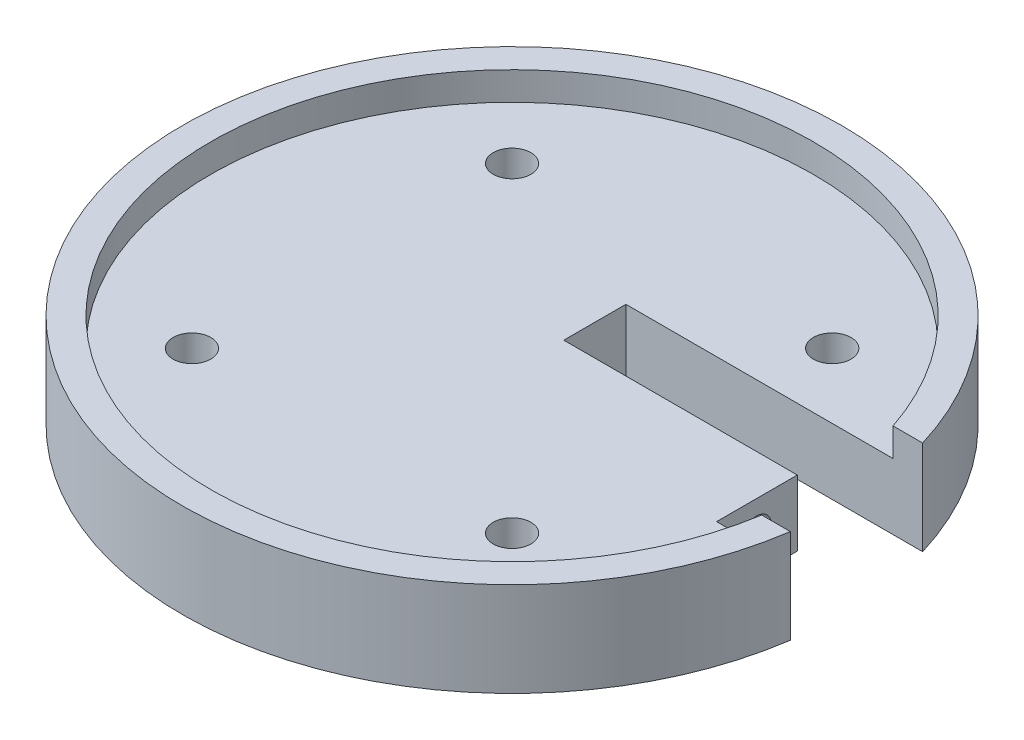
ISO-10303-21;
HEADER;
FILE_DESCRIPTION(('STEP AP214'),'2;1');
FILE_NAME('part.step','',(''),(''),'','','');
FILE_SCHEMA(('AUTOMOTIVE_DESIGN { 1 0 10303 214 1 1 1 1 }'));
ENDSEC;
DATA;
#1=APPLICATION_CONTEXT('core data for automotive mechanical design processes');
#2=APPLICATION_PROTOCOL_DEFINITION('international standard','automotive_design',2000,#1);
#3=PRODUCT_CONTEXT('',#1,'mechanical');
#4=PRODUCT('Part','Part','',(#3));
#5=PRODUCT_RELATED_PRODUCT_CATEGORY('part','',(#4));
#6=PRODUCT_DEFINITION_FORMATION('','',#4);
#7=PRODUCT_DEFINITION_CONTEXT('part definition',#1,'design');
#8=PRODUCT_DEFINITION('design','',#6,#7);
#9=PRODUCT_DEFINITION_SHAPE('','',#8);
#10=(LENGTH_UNIT() NAMED_UNIT(*) SI_UNIT(.MILLI.,.METRE.));
#11=(NAMED_UNIT(*) PLANE_ANGLE_UNIT() SI_UNIT($,.RADIAN.));
#12=(NAMED_UNIT(*) SI_UNIT($,.STERADIAN.) SOLID_ANGLE_UNIT());
#13=UNCERTAINTY_MEASURE_WITH_UNIT(LENGTH_MEASURE(1.E-05),#10,'distance_accuracy_value','');
#14=(GEOMETRIC_REPRESENTATION_CONTEXT(3) GLOBAL_UNCERTAINTY_ASSIGNED_CONTEXT((#13)) GLOBAL_UNIT_ASSIGNED_CONTEXT((#10,
#11,#12)) REPRESENTATION_CONTEXT('',''));
#15=CARTESIAN_POINT('',(0.,0.,0.));
#16=DIRECTION('',(0.,0.,1.));
#17=DIRECTION('',(1.,0.,0.));
#18=AXIS2_PLACEMENT_3D('',#15,#16,#17);
#19=CARTESIAN_POINT('',(26.8023269621628,0.,-3.49209607444166));
#20=DIRECTION('',(-1.,0.,0.));
#21=DIRECTION('',(0.,0.,1.));
#22=AXIS2_PLACEMENT_3D('',#19,#20,#21);
#23=PLANE('',#22);
#24=CARTESIAN_POINT('',(26.8023269621628,3.80105562241668,0.847360281370512));
#25=DIRECTION('',(1.,0.,0.));
#26=DIRECTION('',(0.,0.,-1.));
#27=AXIS2_PLACEMENT_3D('',#24,#25,#26);
#28=CIRCLE('',#27,1.6);
#29=CARTESIAN_POINT('',(26.8023269621628,3.80105562241668,-0.752639718629488));
#30=VERTEX_POINT('',#29);
#31=EDGE_CURVE('E137',#30,#30,#28,.T.);
#32=ORIENTED_EDGE('',*,*,#31,.F.);
#33=EDGE_LOOP('',(#32));
#34=FACE_BOUND('',#33,.T.);
#35=DIRECTION('',(0.,0.,-1.));
#36=VECTOR('',#35,1.);
#37=CARTESIAN_POINT('',(26.8023269621628,7.,-3.49209607444166));
#38=LINE('',#37,#36);
#39=CARTESIAN_POINT('',(26.8023269621628,7.,5.08084170476093));
#40=VERTEX_POINT('',#39);
#41=CARTESIAN_POINT('',(26.8023269621628,7.,-3.49209607444166));
#42=VERTEX_POINT('',#41);
#43=EDGE_CURVE('E154',#40,#42,#38,.T.);
#44=ORIENTED_EDGE('',*,*,#43,.F.);
#45=DIRECTION('',(0.,1.,0.));
#46=VECTOR('',#45,1.);
#47=CARTESIAN_POINT('',(26.8023269621628,0.,5.08084170476093));
#48=LINE('',#47,#46);
#49=CARTESIAN_POINT('',(26.8023269621628,0.,5.08084170476093));
#50=VERTEX_POINT('',#49);
#51=EDGE_CURVE('E175',#50,#40,#48,.T.);
#52=ORIENTED_EDGE('',*,*,#51,.F.);
#53=DIRECTION('',(0.,0.,1.));
#54=VECTOR('',#53,1.);
#55=CARTESIAN_POINT('',(26.8023269621628,0.,-3.49209607444166));
#56=LINE('',#55,#54);
#57=CARTESIAN_POINT('',(26.8023269621628,0.,-3.49209607444166));
#58=VERTEX_POINT('',#57);
#59=EDGE_CURVE('E170',#58,#50,#56,.T.);
#60=ORIENTED_EDGE('',*,*,#59,.F.);
#61=DIRECTION('',(0.,1.,0.));
#62=VECTOR('',#61,1.);
#63=CARTESIAN_POINT('',(26.8023269621628,0.,-3.49209607444166));
#64=LINE('',#63,#62);
#65=EDGE_CURVE('E112',#58,#42,#64,.T.);
#66=ORIENTED_EDGE('',*,*,#65,.T.);
#67=EDGE_LOOP('',(#44,#52,#60,#66));
#68=FACE_BOUND('',#67,.T.);
#69=ADVANCED_FACE('F33',(#34,#68),#23,.F.);
#70=CARTESIAN_POINT('',(-17.,0.,-17.));
#71=DIRECTION('',(0.,1.,0.));
#72=DIRECTION('',(0.,0.,1.));
#73=AXIS2_PLACEMENT_3D('',#70,#71,#72);
#74=CYLINDRICAL_SURFACE('',#73,2.);
#75=CARTESIAN_POINT('',(-17.,0.,-17.));
#76=DIRECTION('',(0.,1.,0.));
#77=DIRECTION('',(0.,0.,1.));
#78=AXIS2_PLACEMENT_3D('',#75,#76,#77);
#79=CIRCLE('',#78,2.);
#80=CARTESIAN_POINT('',(-17.,0.,-15.));
#81=VERTEX_POINT('',#80);
#82=EDGE_CURVE('E166',#81,#81,#79,.T.);
#83=ORIENTED_EDGE('',*,*,#82,.F.);
#84=EDGE_LOOP('',(#83));
#85=FACE_BOUND('',#84,.T.);
#86=CARTESIAN_POINT('',(-17.,7.,-17.));
#87=DIRECTION('',(0.,1.,0.));
#88=DIRECTION('',(0.,0.,1.));
#89=AXIS2_PLACEMENT_3D('',#86,#87,#88);
#90=CIRCLE('',#89,2.);
#91=CARTESIAN_POINT('',(-17.,7.,-15.));
#92=VERTEX_POINT('',#91);
#93=EDGE_CURVE('E151',#92,#92,#90,.F.);
#94=ORIENTED_EDGE('',*,*,#93,.F.);
#95=EDGE_LOOP('',(#94));
#96=FACE_BOUND('',#95,.T.);
#97=ADVANCED_FACE('F236',(#85,#96),#74,.F.);
#98=CARTESIAN_POINT('',(17.,10.,-17.));
#99=DIRECTION('',(0.,-1.,0.));
#100=DIRECTION('',(0.,0.,-1.));
#101=AXIS2_PLACEMENT_3D('',#98,#99,#100);
#102=CYLINDRICAL_SURFACE('',#101,2.);
#103=CARTESIAN_POINT('',(17.,0.,-17.));
#104=DIRECTION('',(0.,-1.,0.));
#105=DIRECTION('',(0.,0.,-1.));
#106=AXIS2_PLACEMENT_3D('',#103,#104,#105);
#107=CIRCLE('',#106,2.);
#108=CARTESIAN_POINT('',(17.,0.,-19.));
#109=VERTEX_POINT('',#108);
#110=EDGE_CURVE('E163',#109,#109,#107,.T.);
#111=ORIENTED_EDGE('',*,*,#110,.T.);
#112=EDGE_LOOP('',(#111));
#113=FACE_BOUND('',#112,.T.);
#114=CARTESIAN_POINT('',(17.,7.,-17.));
#115=DIRECTION('',(0.,1.,0.));
#116=DIRECTION('',(0.,0.,1.));
#117=AXIS2_PLACEMENT_3D('',#114,#115,#116);
#118=CIRCLE('',#117,2.);
#119=CARTESIAN_POINT('',(17.,7.,-15.));
#120=VERTEX_POINT('',#119);
#121=EDGE_CURVE('E148',#120,#120,#118,.F.);
#122=ORIENTED_EDGE('',*,*,#121,.F.);
#123=EDGE_LOOP('',(#122));
#124=FACE_BOUND('',#123,.T.);
#125=ADVANCED_FACE('F232',(#113,#124),#102,.F.);
#126=CARTESIAN_POINT('',(-17.,10.,17.));
#127=DIRECTION('',(0.,-1.,0.));
#128=DIRECTION('',(0.,0.,-1.));
#129=AXIS2_PLACEMENT_3D('',#126,#127,#128);
#130=CYLINDRICAL_SURFACE('',#129,2.);
#131=CARTESIAN_POINT('',(-17.,0.,17.));
#132=DIRECTION('',(0.,-1.,0.));
#133=DIRECTION('',(0.,0.,-1.));
#134=AXIS2_PLACEMENT_3D('',#131,#132,#133);
#135=CIRCLE('',#134,2.);
#136=CARTESIAN_POINT('',(-17.,0.,15.));
#137=VERTEX_POINT('',#136);
#138=EDGE_CURVE('E160',#137,#137,#135,.T.);
#139=ORIENTED_EDGE('',*,*,#138,.T.);
#140=EDGE_LOOP('',(#139));
#141=FACE_BOUND('',#140,.T.);
#142=CARTESIAN_POINT('',(-17.,7.,17.));
#143=DIRECTION('',(0.,1.,0.));
#144=DIRECTION('',(0.,0.,1.));
#145=AXIS2_PLACEMENT_3D('',#142,#143,#144);
#146=CIRCLE('',#145,2.);
#147=CARTESIAN_POINT('',(-17.,7.,19.));
#148=VERTEX_POINT('',#147);
#149=EDGE_CURVE('E145',#148,#148,#146,.F.);
#150=ORIENTED_EDGE('',*,*,#149,.F.);
#151=EDGE_LOOP('',(#150));
#152=FACE_BOUND('',#151,.T.);
#153=ADVANCED_FACE('F228',(#141,#152),#130,.F.);
#154=CARTESIAN_POINT('',(17.,10.,17.));
#155=DIRECTION('',(0.,-1.,0.));
#156=DIRECTION('',(0.,0.,-1.));
#157=AXIS2_PLACEMENT_3D('',#154,#155,#156);
#158=CYLINDRICAL_SURFACE('',#157,2.);
#159=CARTESIAN_POINT('',(17.,0.,17.));
#160=DIRECTION('',(0.,-1.,0.));
#161=DIRECTION('',(0.,0.,-1.));
#162=AXIS2_PLACEMENT_3D('',#159,#160,#161);
#163=CIRCLE('',#162,2.);
#164=CARTESIAN_POINT('',(17.,0.,15.));
#165=VERTEX_POINT('',#164);
#166=EDGE_CURVE('E157',#165,#165,#163,.T.);
#167=ORIENTED_EDGE('',*,*,#166,.T.);
#168=EDGE_LOOP('',(#167));
#169=FACE_BOUND('',#168,.T.);
#170=CARTESIAN_POINT('',(17.,7.,17.));
#171=DIRECTION('',(0.,1.,0.));
#172=DIRECTION('',(0.,0.,1.));
#173=AXIS2_PLACEMENT_3D('',#170,#171,#172);
#174=CIRCLE('',#173,2.);
#175=CARTESIAN_POINT('',(17.,7.,19.));
#176=VERTEX_POINT('',#175);
#177=EDGE_CURVE('E143',#176,#176,#174,.F.);
#178=ORIENTED_EDGE('',*,*,#177,.F.);
#179=EDGE_LOOP('',(#178));
#180=FACE_BOUND('',#179,.T.);
#181=ADVANCED_FACE('F225',(#169,#180),#158,.F.);
#182=CARTESIAN_POINT('',(0.,10.,0.));
#183=DIRECTION('',(0.,-1.,0.));
#184=DIRECTION('',(0.,0.,-1.));
#185=AXIS2_PLACEMENT_3D('',#182,#183,#184);
#186=CYLINDRICAL_SURFACE('',#185,35.);
#187=CARTESIAN_POINT('',(-35.,0.923212584036088,0.));
#188=CARTESIAN_POINT('',(-34.9999987113355,0.970770027813447,-0.161490793502893));
#189=CARTESIAN_POINT('',(-34.9988715856203,1.03198490601423,-0.319079757980077));
#190=CARTESIAN_POINT('',(-34.9948040443405,1.18001665800052,-0.621862354062942));
#191=CARTESIAN_POINT('',(-34.9918615485993,1.26686284227518,-0.767041548102503));
#192=CARTESIAN_POINT('',(-34.984792432974,1.46361406353998,-1.0406911563189));
#193=CARTESIAN_POINT('',(-34.9806664688793,1.57350632108003,-1.16917076701597));
#194=CARTESIAN_POINT('',(-34.9719551944163,1.81323723113989,-1.40584814886978));
#195=CARTESIAN_POINT('',(-34.9673699877939,1.9430713821732,-1.51405048501152));
#196=CARTESIAN_POINT('',(-34.9584672800096,2.21927746237046,-1.70732849372381));
#197=CARTESIAN_POINT('',(-34.9541502378551,2.36567659925177,-1.79236531341154));
#198=CARTESIAN_POINT('',(-34.9464533121318,2.67070084002964,-1.93665914358067));
#199=CARTESIAN_POINT('',(-34.9430734571982,2.82932631730591,-1.995915366382));
#200=CARTESIAN_POINT('',(-34.9377562788584,3.15423030570815,-2.08693111434654));
#201=CARTESIAN_POINT('',(-34.9358183414796,3.32050552748937,-2.11870234363781));
#202=CARTESIAN_POINT('',(-34.9336676045346,3.65603987948844,-2.15387693379364));
#203=CARTESIAN_POINT('',(-34.93345478338,3.82529897233897,-2.15728064965495));
#204=CARTESIAN_POINT('',(-34.9347842134457,4.16169710766299,-2.13564137387501));
#205=CARTESIAN_POINT('',(-34.9363235415654,4.32883921212232,-2.11064576079847));
#206=CARTESIAN_POINT('',(-34.9409272924479,4.65654948269462,-2.0330018985213));
#207=CARTESIAN_POINT('',(-34.9439917195039,4.81711763030101,-1.98035357148034));
#208=CARTESIAN_POINT('',(-34.9511939812794,5.1272042791438,-1.84887818344558));
#209=CARTESIAN_POINT('',(-34.9553322639276,5.27671813587399,-1.77004019431718));
#210=CARTESIAN_POINT('',(-34.964054994202,5.56040751354417,-1.58842455541034));
#211=CARTESIAN_POINT('',(-34.9686394480342,5.69458282107499,-1.48564657260905));
#212=CARTESIAN_POINT('',(-34.9775377766643,5.94402474619005,-1.25885549016796));
#213=CARTESIAN_POINT('',(-34.9818511795597,6.05925892130771,-1.13480668500993));
#214=CARTESIAN_POINT('',(-34.9894597779883,6.26727343393734,-0.869100223555232));
#215=CARTESIAN_POINT('',(-34.9927549784068,6.36005387918284,-0.727442651750777));
#216=CARTESIAN_POINT('',(-34.9976650960806,6.52047149326415,-0.430615134186342));
#217=CARTESIAN_POINT('',(-34.9992809426599,6.58812255491282,-0.275452713344209));
#218=CARTESIAN_POINT('',(-35.0003365205888,6.69641636613735,0.044033170950188));
#219=CARTESIAN_POINT('',(-34.9997762948787,6.73705964863759,0.208356453568637));
#220=CARTESIAN_POINT('',(-34.9962122622226,6.79011288676922,0.541034065256287));
#221=CARTESIAN_POINT('',(-34.9932148051419,6.80259589145416,0.709376817222017));
#222=CARTESIAN_POINT('',(-34.9847792818742,6.79921163235153,1.04571393756858));
#223=CARTESIAN_POINT('',(-34.9793412237102,6.7833444617589,1.21370830709283));
#224=CARTESIAN_POINT('',(-34.9662950618867,6.72375593072267,1.54454559675917));
#225=CARTESIAN_POINT('',(-34.9586875339288,6.680041956058,1.70738987083831));
#226=CARTESIAN_POINT('',(-34.9418216189781,6.5660401407258,2.02340363323523));
#227=CARTESIAN_POINT('',(-34.9325631914156,6.49575164696208,2.17657288367136));
#228=CARTESIAN_POINT('',(-34.9130810956507,6.33029792867476,2.4694979947417));
#229=CARTESIAN_POINT('',(-34.9028540473763,6.23504337539846,2.60920317484709));
#230=CARTESIAN_POINT('',(-34.882323963613,6.02245990206357,2.87066269852433));
#231=CARTESIAN_POINT('',(-34.8720209264707,5.90513050033644,2.99241665030075));
#232=CARTESIAN_POINT('',(-34.8522183913902,5.65130942850385,3.21487356670649));
#233=CARTESIAN_POINT('',(-34.8427212788554,5.51476384956449,3.31551525380659));
#234=CARTESIAN_POINT('',(-34.8254342771991,5.22660624502898,3.49242874178454));
#235=CARTESIAN_POINT('',(-34.8176443618568,5.07499445088533,3.56870091695956));
#236=CARTESIAN_POINT('',(-34.8045211223669,4.76140364982748,3.69449901063162));
#237=CARTESIAN_POINT('',(-34.7991815477988,4.59945223467926,3.74409303708652));
#238=CARTESIAN_POINT('',(-34.7914391117942,4.2694536542725,3.81537230525147));
#239=CARTESIAN_POINT('',(-34.7890361406344,4.10140671700881,3.83705858970883));
#240=CARTESIAN_POINT('',(-34.7874025966594,3.76494290642798,3.85184072180262));
#241=CARTESIAN_POINT('',(-34.7881552269656,3.59653274889024,3.84508794620467));
#242=CARTESIAN_POINT('',(-34.7927226567193,3.2632535021302,3.80353500098681));
#243=CARTESIAN_POINT('',(-34.796537436125,3.09838438973892,3.76873501493659));
#244=CARTESIAN_POINT('',(-34.8068608895746,2.77703594995725,3.67216154134135));
#245=CARTESIAN_POINT('',(-34.8133666159292,2.6205476533404,3.61041756444475));
#246=CARTESIAN_POINT('',(-34.8284640174083,2.32014271777481,3.46174095080275));
#247=CARTESIAN_POINT('',(-34.8370557546003,2.17622645307045,3.37480756455107));
#248=CARTESIAN_POINT('',(-34.8555828903795,1.90433112792917,3.1777582393418));
#249=CARTESIAN_POINT('',(-34.8655242960861,1.77642853417348,3.06753735717101));
#250=CARTESIAN_POINT('',(-34.8858295460127,1.54090103980295,2.82726011356559));
#251=CARTESIAN_POINT('',(-34.8961933866016,1.43327596493873,2.69720392259771));
#252=CARTESIAN_POINT('',(-34.9164916868301,1.24090976646656,2.42031529164007));
#253=CARTESIAN_POINT('',(-34.9264242138236,1.15626418233744,2.27341631734475));
#254=CARTESIAN_POINT('',(-34.9449987351661,1.01284077788571,1.96736840612572));
#255=CARTESIAN_POINT('',(-34.9536404403533,0.954068747866063,1.80821673649589));
#256=CARTESIAN_POINT('',(-34.9689751969092,0.864161587279006,1.48234893844686));
#257=CARTESIAN_POINT('',(-34.9756697927502,0.833004511782243,1.31563892740845));
#258=CARTESIAN_POINT('',(-34.9866969583521,0.799214875138458,0.979407642382395));
#259=CARTESIAN_POINT('',(-34.991032255109,0.79654931532531,0.809889848407409));
#260=CARTESIAN_POINT('',(-34.9961132508208,0.815597067729106,0.532853575063793));
#261=CARTESIAN_POINT('',(-34.9975870617595,0.828984731959357,0.424707199610565));
#262=CARTESIAN_POINT('',(-34.9995308508325,0.867415350192123,0.210496651145066));
#263=CARTESIAN_POINT('',(-35.0000008333504,0.892458253295265,0.104432469041795));
#264=CARTESIAN_POINT('',(-35.,0.923212584036088,0.));
#265=B_SPLINE_CURVE_WITH_KNOTS('',3,(#187,#188,#189,#190,#191,#192,#193,#194,#195,#196,#197,
#198,#199,#200,#201,#202,#203,#204,#205,#206,#207,#208,#209,#210,#211,#212,#213,#214,#215,#216,
#217,#218,#219,#220,#221,#222,#223,#224,#225,#226,#227,#228,#229,#230,#231,#232,#233,#234,#235,
#236,#237,#238,#239,#240,#241,#242,#243,#244,#245,#246,#247,#248,#249,#250,#251,#252,#253,#254,
#255,#256,#257,#258,#259,#260,#261,#262,#263,#264),.UNSPECIFIED.,.T.,.F.,(4,2,2,2,2,2,2,2,2,2,2,
2,2,2,2,2,2,2,2,2,2,2,2,2,2,2,2,2,2,2,2,2,2,2,2,2,2,2,4),(0.,0.504645716037534,1.00987076681503,
1.51481639876665,2.01964821632747,2.525321589654,3.03101041184224,3.53648378685276,
4.04195083625835,4.54657585226834,5.05120228876788,5.55603955529032,6.0608838448887,
6.56658402149386,7.07228177168958,7.5776995286396,8.0831073122614,8.58720252989054,
9.09129609042108,9.59525600637546,10.0992283084692,10.6050290456043,11.1108408204849,
11.6181009801707,12.1253533483517,12.6313045060158,13.1372367587277,13.6404794246561,
14.1437187968756,14.6464083696196,15.1491129013362,15.6541330852572,16.1591489292256,
16.6662333428544,17.1734311804694,17.6802255980378,18.1864329863109,18.512777461585,
18.8391205116996),.UNSPECIFIED.);
#266=CARTESIAN_POINT('',(-35.,0.923212584036088,0.));
#267=VERTEX_POINT('',#266);
#268=EDGE_CURVE('E193',#267,#267,#265,.T.);
#269=ORIENTED_EDGE('',*,*,#268,.T.);
#270=EDGE_LOOP('',(#269));
#271=FACE_BOUND('',#270,.T.);
#272=CARTESIAN_POINT('',(0.,10.,0.));
#273=DIRECTION('',(0.,1.,0.));
#274=DIRECTION('',(0.,0.,1.));
#275=AXIS2_PLACEMENT_3D('',#272,#273,#274);
#276=CIRCLE('',#275,35.);
#277=CARTESIAN_POINT('',(33.5134241286121,10.,-10.0920960744417));
#278=VERTEX_POINT('',#277);
#279=CARTESIAN_POINT('',(34.6292513284819,10.,5.08084170476093));
#280=VERTEX_POINT('',#279);
#281=EDGE_CURVE('E185',#278,#280,#276,.T.);
#282=ORIENTED_EDGE('',*,*,#281,.F.);
#283=DIRECTION('',(0.,-1.,0.));
#284=VECTOR('',#283,1.);
#285=CARTESIAN_POINT('',(33.5134241286121,10.,-10.0920960744417));
#286=LINE('',#285,#284);
#287=CARTESIAN_POINT('',(33.5134241286121,0.,-10.0920960744417));
#288=VERTEX_POINT('',#287);
#289=EDGE_CURVE('E128',#278,#288,#286,.T.);
#290=ORIENTED_EDGE('',*,*,#289,.T.);
#291=CARTESIAN_POINT('',(0.,0.,0.));
#292=DIRECTION('',(0.,1.,0.));
#293=DIRECTION('',(0.,0.,1.));
#294=AXIS2_PLACEMENT_3D('',#291,#292,#293);
#295=CIRCLE('',#294,35.);
#296=CARTESIAN_POINT('',(34.6292513284819,0.,5.08084170476093));
#297=VERTEX_POINT('',#296);
#298=EDGE_CURVE('E184',#288,#297,#295,.T.);
#299=ORIENTED_EDGE('',*,*,#298,.T.);
#300=DIRECTION('',(0.,-1.,0.));
#301=VECTOR('',#300,1.);
#302=CARTESIAN_POINT('',(34.6292513284819,10.,5.08084170476093));
#303=LINE('',#302,#301);
#304=EDGE_CURVE('E179',#297,#280,#303,.F.);
#305=ORIENTED_EDGE('',*,*,#304,.T.);
#306=EDGE_LOOP('',(#282,#290,#299,#305));
#307=FACE_BOUND('',#306,.T.);
#308=ADVANCED_FACE('F35',(#271,#307),#186,.T.);
#309=CARTESIAN_POINT('',(0.,10.,0.));
#310=DIRECTION('',(0.,1.,0.));
#311=DIRECTION('',(0.,0.,1.));
#312=AXIS2_PLACEMENT_3D('',#309,#310,#311);
#313=PLANE('',#312);
#314=DIRECTION('',(1.,0.,0.));
#315=VECTOR('',#314,1.);
#316=CARTESIAN_POINT('',(1.99984246285112,10.,-10.0920960744417));
#317=LINE('',#316,#315);
#318=CARTESIAN_POINT('',(30.3669161559787,10.,-10.0920960744417));
#319=VERTEX_POINT('',#318);
#320=EDGE_CURVE('E106',#319,#278,#317,.T.);
#321=ORIENTED_EDGE('',*,*,#320,.T.);
#322=ORIENTED_EDGE('',*,*,#281,.T.);
#323=DIRECTION('',(1.,0.,0.));
#324=VECTOR('',#323,1.);
#325=CARTESIAN_POINT('',(35.2527942016625,10.,5.08084170476093));
#326=LINE('',#325,#324);
#327=CARTESIAN_POINT('',(31.5940666513692,10.,5.08084170476093));
#328=VERTEX_POINT('',#327);
#329=EDGE_CURVE('E169',#328,#280,#326,.T.);
#330=ORIENTED_EDGE('',*,*,#329,.F.);
#331=CARTESIAN_POINT('',(0.,10.,0.));
#332=DIRECTION('',(0.,1.,0.));
#333=DIRECTION('',(0.,0.,1.));
#334=AXIS2_PLACEMENT_3D('',#331,#332,#333);
#335=CIRCLE('',#334,32.);
#336=EDGE_CURVE('E140',#319,#328,#335,.T.);
#337=ORIENTED_EDGE('',*,*,#336,.F.);
#338=EDGE_LOOP('',(#321,#322,#330,#337));
#339=FACE_BOUND('',#338,.T.);
#340=ADVANCED_FACE('F247',(#339),#313,.T.);
#341=CARTESIAN_POINT('',(0.,0.,0.));
#342=DIRECTION('',(0.,1.,0.));
#343=DIRECTION('',(0.,0.,1.));
#344=AXIS2_PLACEMENT_3D('',#341,#342,#343);
#345=PLANE('',#344);
#346=ORIENTED_EDGE('',*,*,#166,.F.);
#347=EDGE_LOOP('',(#346));
#348=FACE_BOUND('',#347,.T.);
#349=ORIENTED_EDGE('',*,*,#138,.F.);
#350=EDGE_LOOP('',(#349));
#351=FACE_BOUND('',#350,.T.);
#352=ORIENTED_EDGE('',*,*,#110,.F.);
#353=EDGE_LOOP('',(#352));
#354=FACE_BOUND('',#353,.T.);
#355=ORIENTED_EDGE('',*,*,#82,.T.);
#356=EDGE_LOOP('',(#355));
#357=FACE_BOUND('',#356,.T.);
#358=ORIENTED_EDGE('',*,*,#298,.F.);
#359=DIRECTION('',(1.,0.,0.));
#360=VECTOR('',#359,1.);
#361=CARTESIAN_POINT('',(39.4719761235933,0.,-10.0920960744417));
#362=LINE('',#361,#360);
#363=CARTESIAN_POINT('',(1.99984246285112,0.,-10.0920960744417));
#364=VERTEX_POINT('',#363);
#365=EDGE_CURVE('E119',#364,#288,#362,.T.);
#366=ORIENTED_EDGE('',*,*,#365,.F.);
#367=DIRECTION('',(0.,0.,-1.));
#368=VECTOR('',#367,1.);
#369=CARTESIAN_POINT('',(1.99984246285112,0.,-3.49209607444166));
#370=LINE('',#369,#368);
#371=CARTESIAN_POINT('',(1.99984246285112,0.,-3.49209607444166));
#372=VERTEX_POINT('',#371);
#373=EDGE_CURVE('E101',#372,#364,#370,.T.);
#374=ORIENTED_EDGE('',*,*,#373,.F.);
#375=DIRECTION('',(-1.,0.,0.));
#376=VECTOR('',#375,1.);
#377=CARTESIAN_POINT('',(26.8023269621628,0.,-3.49209607444166));
#378=LINE('',#377,#376);
#379=EDGE_CURVE('E109',#58,#372,#378,.T.);
#380=ORIENTED_EDGE('',*,*,#379,.F.);
#381=ORIENTED_EDGE('',*,*,#59,.T.);
#382=DIRECTION('',(1.,0.,0.));
#383=VECTOR('',#382,1.);
#384=CARTESIAN_POINT('',(35.2527942016625,0.,5.08084170476093));
#385=LINE('',#384,#383);
#386=EDGE_CURVE('E172',#50,#297,#385,.T.);
#387=ORIENTED_EDGE('',*,*,#386,.T.);
#388=EDGE_LOOP('',(#358,#366,#374,#380,#381,#387));
#389=FACE_BOUND('',#388,.T.);
#390=ADVANCED_FACE('F118',(#348,#351,#354,#357,#389),#345,.F.);
#391=CARTESIAN_POINT('',(35.2527942016625,0.,5.08084170476093));
#392=DIRECTION('',(0.,0.,1.));
#393=DIRECTION('',(1.,0.,0.));
#394=AXIS2_PLACEMENT_3D('',#391,#392,#393);
#395=PLANE('',#394);
#396=DIRECTION('',(-1.,0.,0.));
#397=VECTOR('',#396,1.);
#398=CARTESIAN_POINT('',(35.2527942016625,7.,5.08084170476093));
#399=LINE('',#398,#397);
#400=CARTESIAN_POINT('',(31.5940666513692,7.,5.08084170476093));
#401=VERTEX_POINT('',#400);
#402=EDGE_CURVE('E57',#401,#40,#399,.T.);
#403=ORIENTED_EDGE('',*,*,#402,.F.);
#404=DIRECTION('',(0.,1.,0.));
#405=VECTOR('',#404,1.);
#406=CARTESIAN_POINT('',(31.5940666513692,7.,5.08084170476093));
#407=LINE('',#406,#405);
#408=EDGE_CURVE('E187',#401,#328,#407,.T.);
#409=ORIENTED_EDGE('',*,*,#408,.T.);
#410=ORIENTED_EDGE('',*,*,#329,.T.);
#411=ORIENTED_EDGE('',*,*,#304,.F.);
#412=ORIENTED_EDGE('',*,*,#386,.F.);
#413=ORIENTED_EDGE('',*,*,#51,.T.);
#414=EDGE_LOOP('',(#403,#409,#410,#411,#412,#413));
#415=FACE_BOUND('',#414,.T.);
#416=ADVANCED_FACE('F223',(#415),#395,.F.);
#417=CARTESIAN_POINT('',(0.,7.,0.));
#418=DIRECTION('',(0.,1.,0.));
#419=DIRECTION('',(0.,0.,1.));
#420=AXIS2_PLACEMENT_3D('',#417,#418,#419);
#421=CYLINDRICAL_SURFACE('',#420,32.);
#422=CARTESIAN_POINT('',(0.,7.,0.));
#423=DIRECTION('',(0.,1.,0.));
#424=DIRECTION('',(0.,0.,1.));
#425=AXIS2_PLACEMENT_3D('',#422,#423,#424);
#426=CIRCLE('',#425,32.);
#427=CARTESIAN_POINT('',(30.3669161559787,7.,-10.0920960744417));
#428=VERTEX_POINT('',#427);
#429=EDGE_CURVE('E141',#428,#401,#426,.T.);
#430=ORIENTED_EDGE('',*,*,#429,.F.);
#431=DIRECTION('',(0.,1.,0.));
#432=VECTOR('',#431,1.);
#433=CARTESIAN_POINT('',(30.3669161559787,7.,-10.0920960744417));
#434=LINE('',#433,#432);
#435=EDGE_CURVE('E124',#428,#319,#434,.T.);
#436=ORIENTED_EDGE('',*,*,#435,.T.);
#437=ORIENTED_EDGE('',*,*,#336,.T.);
#438=ORIENTED_EDGE('',*,*,#408,.F.);
#439=EDGE_LOOP('',(#430,#436,#437,#438));
#440=FACE_BOUND('',#439,.T.);
#441=ADVANCED_FACE('F220',(#440),#421,.F.);
#442=CARTESIAN_POINT('',(0.,7.,0.));
#443=DIRECTION('',(0.,1.,0.));
#444=DIRECTION('',(0.,0.,1.));
#445=AXIS2_PLACEMENT_3D('',#442,#443,#444);
#446=PLANE('',#445);
#447=DIRECTION('',(-1.,0.,0.));
#448=VECTOR('',#447,1.);
#449=CARTESIAN_POINT('',(0.,7.,-10.0920960744417));
#450=LINE('',#449,#448);
#451=CARTESIAN_POINT('',(1.99984246285112,7.,-10.0920960744417));
#452=VERTEX_POINT('',#451);
#453=EDGE_CURVE('E11',#428,#452,#450,.T.);
#454=ORIENTED_EDGE('',*,*,#453,.F.);
#455=ORIENTED_EDGE('',*,*,#429,.T.);
#456=ORIENTED_EDGE('',*,*,#402,.T.);
#457=ORIENTED_EDGE('',*,*,#43,.T.);
#458=DIRECTION('',(1.,0.,0.));
#459=VECTOR('',#458,1.);
#460=CARTESIAN_POINT('',(0.,7.,-3.49209607444166));
#461=LINE('',#460,#459);
#462=CARTESIAN_POINT('',(1.99984246285112,7.,-3.49209607444166));
#463=VERTEX_POINT('',#462);
#464=EDGE_CURVE('E200',#463,#42,#461,.T.);
#465=ORIENTED_EDGE('',*,*,#464,.F.);
#466=DIRECTION('',(0.,0.,1.));
#467=VECTOR('',#466,1.);
#468=CARTESIAN_POINT('',(1.99984246285112,7.,0.));
#469=LINE('',#468,#467);
#470=EDGE_CURVE('E42',#452,#463,#469,.T.);
#471=ORIENTED_EDGE('',*,*,#470,.F.);
#472=EDGE_LOOP('',(#454,#455,#456,#457,#465,#471));
#473=FACE_BOUND('',#472,.T.);
#474=ORIENTED_EDGE('',*,*,#93,.T.);
#475=EDGE_LOOP('',(#474));
#476=FACE_BOUND('',#475,.T.);
#477=ORIENTED_EDGE('',*,*,#121,.T.);
#478=EDGE_LOOP('',(#477));
#479=FACE_BOUND('',#478,.T.);
#480=ORIENTED_EDGE('',*,*,#149,.T.);
#481=EDGE_LOOP('',(#480));
#482=FACE_BOUND('',#481,.T.);
#483=ORIENTED_EDGE('',*,*,#177,.T.);
#484=EDGE_LOOP('',(#483));
#485=FACE_BOUND('',#484,.T.);
#486=ADVANCED_FACE('F216',(#473,#476,#479,#482,#485),#446,.T.);
#487=CARTESIAN_POINT('',(-8.19767303783717,3.80105562241668,0.847360281370512));
#488=DIRECTION('',(1.,0.,0.));
#489=DIRECTION('',(0.,0.,-1.));
#490=AXIS2_PLACEMENT_3D('',#487,#488,#489);
#491=CYLINDRICAL_SURFACE('',#490,1.6);
#492=CARTESIAN_POINT('',(-8.19767303783717,3.80105562241668,0.847360281370512));
#493=DIRECTION('',(1.,0.,0.));
#494=DIRECTION('',(0.,0.,-1.));
#495=AXIS2_PLACEMENT_3D('',#492,#493,#494);
#496=CIRCLE('',#495,1.6);
#497=CARTESIAN_POINT('',(-8.19767303783717,3.80105562241668,-0.752639718629488));
#498=VERTEX_POINT('',#497);
#499=EDGE_CURVE('E134',#498,#498,#496,.F.);
#500=ORIENTED_EDGE('',*,*,#499,.T.);
#501=EDGE_LOOP('',(#500));
#502=FACE_BOUND('',#501,.T.);
#503=ORIENTED_EDGE('',*,*,#31,.T.);
#504=EDGE_LOOP('',(#503));
#505=FACE_BOUND('',#504,.T.);
#506=ADVANCED_FACE('F212',(#502,#505),#491,.F.);
#507=CARTESIAN_POINT('',(-8.19767303783717,6.80105562241667,0.847360281370512));
#508=DIRECTION('',(1.,0.,0.));
#509=DIRECTION('',(0.,0.,-1.));
#510=AXIS2_PLACEMENT_3D('',#507,#508,#509);
#511=PLANE('',#510);
#512=CARTESIAN_POINT('',(-8.19767303783716,3.80105562241668,0.847360281370512));
#513=DIRECTION('',(1.,0.,0.));
#514=DIRECTION('',(0.,0.,-1.));
#515=AXIS2_PLACEMENT_3D('',#512,#513,#514);
#516=CIRCLE('',#515,2.99999999999999);
#517=CARTESIAN_POINT('',(-8.19767303783716,3.80105562241668,-2.15263971862948));
#518=VERTEX_POINT('',#517);
#519=EDGE_CURVE('E131',#518,#518,#516,.T.);
#520=ORIENTED_EDGE('',*,*,#519,.F.);
#521=EDGE_LOOP('',(#520));
#522=FACE_BOUND('',#521,.T.);
#523=ORIENTED_EDGE('',*,*,#499,.F.);
#524=EDGE_LOOP('',(#523));
#525=FACE_BOUND('',#524,.T.);
#526=ADVANCED_FACE('F207',(#522,#525),#511,.F.);
#527=CARTESIAN_POINT('',(-8.19767303783717,3.80105562241668,0.847360281370512));
#528=DIRECTION('',(1.,0.,0.));
#529=DIRECTION('',(0.,0.,-1.));
#530=AXIS2_PLACEMENT_3D('',#527,#528,#529);
#531=CYLINDRICAL_SURFACE('',#530,2.99999999999999);
#532=ORIENTED_EDGE('',*,*,#519,.T.);
#533=EDGE_LOOP('',(#532));
#534=FACE_BOUND('',#533,.T.);
#535=ORIENTED_EDGE('',*,*,#268,.F.);
#536=EDGE_LOOP('',(#535));
#537=FACE_BOUND('',#536,.T.);
#538=ADVANCED_FACE('F201',(#534,#537),#531,.F.);
#539=CARTESIAN_POINT('',(39.4719761235933,10.,-10.0920960744417));
#540=DIRECTION('',(0.,0.,-1.));
#541=DIRECTION('',(-1.,0.,0.));
#542=AXIS2_PLACEMENT_3D('',#539,#540,#541);
#543=PLANE('',#542);
#544=ORIENTED_EDGE('',*,*,#320,.F.);
#545=ORIENTED_EDGE('',*,*,#435,.F.);
#546=ORIENTED_EDGE('',*,*,#453,.T.);
#547=DIRECTION('',(0.,-1.,0.));
#548=VECTOR('',#547,1.);
#549=CARTESIAN_POINT('',(1.99984246285112,10.,-10.0920960744417));
#550=LINE('',#549,#548);
#551=EDGE_CURVE('E105',#452,#364,#550,.T.);
#552=ORIENTED_EDGE('',*,*,#551,.T.);
#553=ORIENTED_EDGE('',*,*,#365,.T.);
#554=ORIENTED_EDGE('',*,*,#289,.F.);
#555=EDGE_LOOP('',(#544,#545,#546,#552,#553,#554));
#556=FACE_BOUND('',#555,.T.);
#557=ADVANCED_FACE('F206',(#556),#543,.F.);
#558=CARTESIAN_POINT('',(26.8023269621628,10.,-3.49209607444166));
#559=DIRECTION('',(0.,0.,1.));
#560=DIRECTION('',(1.,0.,0.));
#561=AXIS2_PLACEMENT_3D('',#558,#559,#560);
#562=PLANE('',#561);
#563=ORIENTED_EDGE('',*,*,#379,.T.);
#564=DIRECTION('',(0.,-1.,0.));
#565=VECTOR('',#564,1.);
#566=CARTESIAN_POINT('',(1.99984246285112,10.,-3.49209607444166));
#567=LINE('',#566,#565);
#568=EDGE_CURVE('E49',#463,#372,#567,.T.);
#569=ORIENTED_EDGE('',*,*,#568,.F.);
#570=ORIENTED_EDGE('',*,*,#464,.T.);
#571=ORIENTED_EDGE('',*,*,#65,.F.);
#572=EDGE_LOOP('',(#563,#569,#570,#571));
#573=FACE_BOUND('',#572,.T.);
#574=ADVANCED_FACE('F110',(#573),#562,.F.);
#575=CARTESIAN_POINT('',(1.99984246285112,10.,-3.49209607444166));
#576=DIRECTION('',(-1.,0.,0.));
#577=DIRECTION('',(0.,0.,1.));
#578=AXIS2_PLACEMENT_3D('',#575,#576,#577);
#579=PLANE('',#578);
#580=ORIENTED_EDGE('',*,*,#470,.T.);
#581=ORIENTED_EDGE('',*,*,#568,.T.);
#582=ORIENTED_EDGE('',*,*,#373,.T.);
#583=ORIENTED_EDGE('',*,*,#551,.F.);
#584=EDGE_LOOP('',(#580,#581,#582,#583));
#585=FACE_BOUND('',#584,.T.);
#586=ADVANCED_FACE('F98',(#585),#579,.F.);
#587=CLOSED_SHELL('',(#69,#97,#125,#153,#181,#308,#340,#390,#416,#441,#486,#506,#526,#538,#557,
#574,#586));
#588=MANIFOLD_SOLID_BREP('B2',#587);
#589=ADVANCED_BREP_SHAPE_REPRESENTATION('',(#18,#588),#14);
#590=SHAPE_DEFINITION_REPRESENTATION(#9,#589);
ENDSEC;
END-ISO-10303-21;
